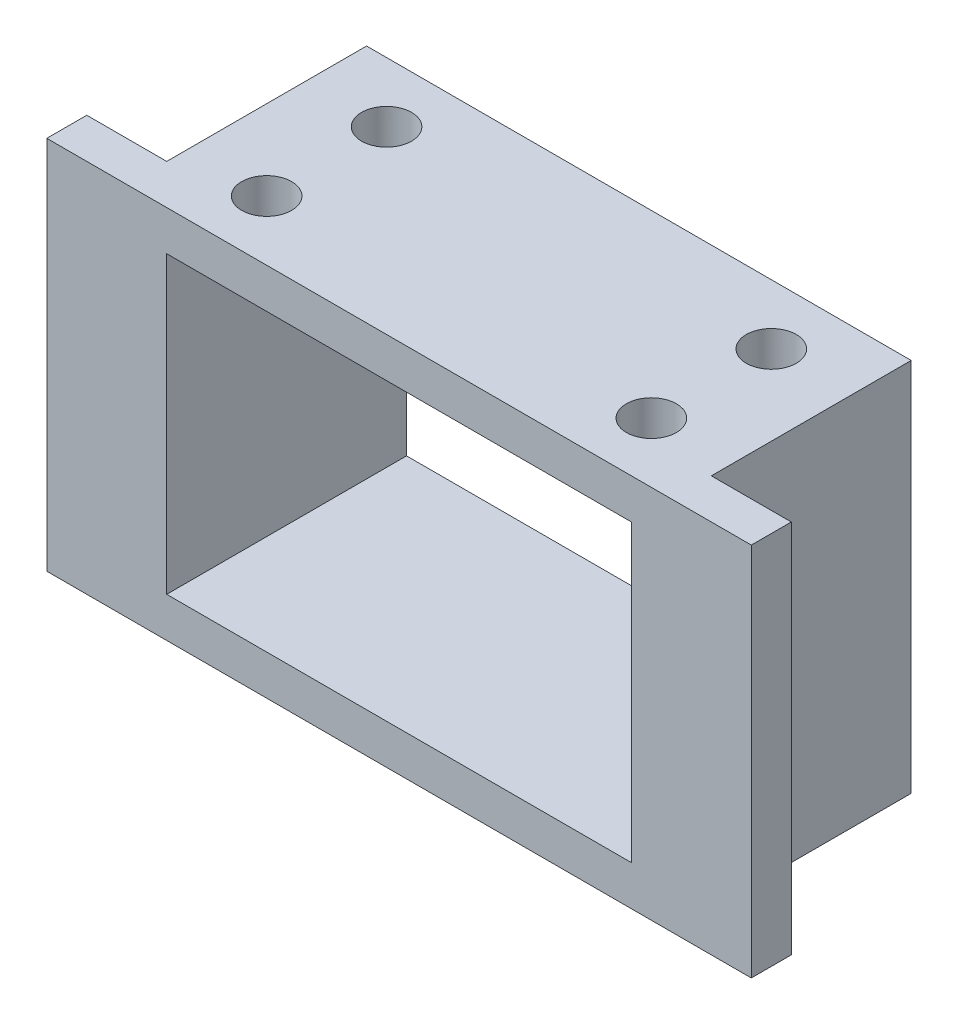
ISO-10303-21;
HEADER;
FILE_DESCRIPTION(('STEP AP214'),'2;1');
FILE_NAME('part.step','',(''),(''),'','','');
FILE_SCHEMA(('AUTOMOTIVE_DESIGN { 1 0 10303 214 1 1 1 1 }'));
ENDSEC;
DATA;
#1=APPLICATION_CONTEXT('core data for automotive mechanical design processes');
#2=APPLICATION_PROTOCOL_DEFINITION('international standard','automotive_design',2000,#1);
#3=PRODUCT_CONTEXT('',#1,'mechanical');
#4=PRODUCT('Part','Part','',(#3));
#5=PRODUCT_RELATED_PRODUCT_CATEGORY('part','',(#4));
#6=PRODUCT_DEFINITION_FORMATION('','',#4);
#7=PRODUCT_DEFINITION_CONTEXT('part definition',#1,'design');
#8=PRODUCT_DEFINITION('design','',#6,#7);
#9=PRODUCT_DEFINITION_SHAPE('','',#8);
#10=(LENGTH_UNIT() NAMED_UNIT(*) SI_UNIT(.MILLI.,.METRE.));
#11=(NAMED_UNIT(*) PLANE_ANGLE_UNIT() SI_UNIT($,.RADIAN.));
#12=(NAMED_UNIT(*) SI_UNIT($,.STERADIAN.) SOLID_ANGLE_UNIT());
#13=UNCERTAINTY_MEASURE_WITH_UNIT(LENGTH_MEASURE(1.E-05),#10,'distance_accuracy_value','');
#14=(GEOMETRIC_REPRESENTATION_CONTEXT(3) GLOBAL_UNCERTAINTY_ASSIGNED_CONTEXT((#13)) GLOBAL_UNIT_ASSIGNED_CONTEXT((#10,
#11,#12)) REPRESENTATION_CONTEXT('',''));
#15=CARTESIAN_POINT('',(0.,0.,0.));
#16=DIRECTION('',(0.,0.,1.));
#17=DIRECTION('',(1.,0.,0.));
#18=AXIS2_PLACEMENT_3D('',#15,#16,#17);
#19=CARTESIAN_POINT('',(0.,0.,18.));
#20=DIRECTION('',(0.,0.,1.));
#21=DIRECTION('',(1.,0.,0.));
#22=AXIS2_PLACEMENT_3D('',#19,#20,#21);
#23=PLANE('',#22);
#24=DIRECTION('',(0.,-1.,0.));
#25=VECTOR('',#24,1.);
#26=CARTESIAN_POINT('',(-2.,2.,18.));
#27=LINE('',#26,#25);
#28=CARTESIAN_POINT('',(-2.,2.,18.));
#29=VERTEX_POINT('',#28);
#30=CARTESIAN_POINT('',(-2.,-16.76,18.));
#31=VERTEX_POINT('',#30);
#32=EDGE_CURVE('E159',#29,#31,#27,.T.);
#33=ORIENTED_EDGE('',*,*,#32,.T.);
#34=DIRECTION('',(-1.,0.,0.));
#35=VECTOR('',#34,1.);
#36=CARTESIAN_POINT('',(0.,-16.76,18.));
#37=LINE('',#36,#35);
#38=CARTESIAN_POINT('',(-6.,-16.76,18.));
#39=VERTEX_POINT('',#38);
#40=EDGE_CURVE('E204',#31,#39,#37,.T.);
#41=ORIENTED_EDGE('',*,*,#40,.T.);
#42=DIRECTION('',(0.,-1.,0.));
#43=VECTOR('',#42,1.);
#44=CARTESIAN_POINT('',(-6.,2.,18.));
#45=LINE('',#44,#43);
#46=CARTESIAN_POINT('',(-6.,2.,18.));
#47=VERTEX_POINT('',#46);
#48=EDGE_CURVE('E198',#47,#39,#45,.T.);
#49=ORIENTED_EDGE('',*,*,#48,.F.);
#50=DIRECTION('',(-1.,0.,0.));
#51=VECTOR('',#50,1.);
#52=CARTESIAN_POINT('',(0.,2.,18.));
#53=LINE('',#52,#51);
#54=EDGE_CURVE('E197',#29,#47,#53,.T.);
#55=ORIENTED_EDGE('',*,*,#54,.F.);
#56=EDGE_LOOP('',(#33,#41,#49,#55));
#57=FACE_BOUND('',#56,.T.);
#58=ADVANCED_FACE('F41',(#57),#23,.F.);
#59=DIRECTION('',(0.,1.,0.));
#60=VECTOR('',#59,1.);
#61=CARTESIAN_POINT('',(25.25,2.,18.));
#62=LINE('',#61,#60);
#63=CARTESIAN_POINT('',(25.25,-16.76,18.));
#64=VERTEX_POINT('',#63);
#65=CARTESIAN_POINT('',(25.25,2.,18.));
#66=VERTEX_POINT('',#65);
#67=EDGE_CURVE('E166',#64,#66,#62,.T.);
#68=ORIENTED_EDGE('',*,*,#67,.T.);
#69=CARTESIAN_POINT('',(29.25,2.,18.));
#70=VERTEX_POINT('',#69);
#71=EDGE_CURVE('E211',#70,#66,#53,.T.);
#72=ORIENTED_EDGE('',*,*,#71,.F.);
#73=DIRECTION('',(0.,1.,0.));
#74=VECTOR('',#73,1.);
#75=CARTESIAN_POINT('',(29.25,2.,18.));
#76=LINE('',#75,#74);
#77=CARTESIAN_POINT('',(29.25,-16.76,18.));
#78=VERTEX_POINT('',#77);
#79=EDGE_CURVE('E227',#78,#70,#76,.T.);
#80=ORIENTED_EDGE('',*,*,#79,.F.);
#81=EDGE_CURVE('E201',#78,#64,#37,.T.);
#82=ORIENTED_EDGE('',*,*,#81,.T.);
#83=EDGE_LOOP('',(#68,#72,#80,#82));
#84=FACE_BOUND('',#83,.T.);
#85=ADVANCED_FACE('F240',(#84),#23,.F.);
#86=CARTESIAN_POINT('',(-2.,-16.76,18.));
#87=DIRECTION('',(0.,1.,0.));
#88=DIRECTION('',(-1.,0.,0.));
#89=AXIS2_PLACEMENT_3D('',#86,#87,#88);
#90=PLANE('',#89);
#91=DIRECTION('',(-1.,0.,0.));
#92=VECTOR('',#91,1.);
#93=CARTESIAN_POINT('',(0.,-16.76,20.));
#94=LINE('',#93,#92);
#95=CARTESIAN_POINT('',(29.25,-16.76,20.));
#96=VERTEX_POINT('',#95);
#97=CARTESIAN_POINT('',(-6.,-16.76,20.));
#98=VERTEX_POINT('',#97);
#99=EDGE_CURVE('E143',#96,#98,#94,.T.);
#100=ORIENTED_EDGE('',*,*,#99,.T.);
#101=DIRECTION('',(0.,0.,-1.));
#102=VECTOR('',#101,1.);
#103=CARTESIAN_POINT('',(-6.,-16.76,28.));
#104=LINE('',#103,#102);
#105=EDGE_CURVE('E187',#98,#39,#104,.T.);
#106=ORIENTED_EDGE('',*,*,#105,.T.);
#107=ORIENTED_EDGE('',*,*,#40,.F.);
#108=DIRECTION('',(0.,0.,-1.));
#109=VECTOR('',#108,1.);
#110=CARTESIAN_POINT('',(-2.,-16.76,18.));
#111=LINE('',#110,#109);
#112=CARTESIAN_POINT('',(-2.,-16.76,8.));
#113=VERTEX_POINT('',#112);
#114=EDGE_CURVE('E177',#31,#113,#111,.T.);
#115=ORIENTED_EDGE('',*,*,#114,.T.);
#116=DIRECTION('',(-1.,0.,0.));
#117=VECTOR('',#116,1.);
#118=CARTESIAN_POINT('',(-2.,-16.76,8.));
#119=LINE('',#118,#117);
#120=CARTESIAN_POINT('',(25.25,-16.76,8.));
#121=VERTEX_POINT('',#120);
#122=EDGE_CURVE('E245',#121,#113,#119,.T.);
#123=ORIENTED_EDGE('',*,*,#122,.F.);
#124=DIRECTION('',(0.,0.,-1.));
#125=VECTOR('',#124,1.);
#126=CARTESIAN_POINT('',(25.25,-16.76,18.));
#127=LINE('',#126,#125);
#128=EDGE_CURVE('E174',#64,#121,#127,.T.);
#129=ORIENTED_EDGE('',*,*,#128,.F.);
#130=ORIENTED_EDGE('',*,*,#81,.F.);
#131=DIRECTION('',(0.,0.,-1.));
#132=VECTOR('',#131,1.);
#133=CARTESIAN_POINT('',(29.25,-16.76,28.));
#134=LINE('',#133,#132);
#135=EDGE_CURVE('E229',#96,#78,#134,.T.);
#136=ORIENTED_EDGE('',*,*,#135,.F.);
#137=EDGE_LOOP('',(#100,#106,#107,#115,#123,#129,#130,#136));
#138=FACE_BOUND('',#137,.T.);
#139=ADVANCED_FACE('F242',(#138),#90,.F.);
#140=CARTESIAN_POINT('',(23.25,0.,18.));
#141=DIRECTION('',(-1.,0.,0.));
#142=DIRECTION('',(0.,-1.,0.));
#143=AXIS2_PLACEMENT_3D('',#140,#141,#142);
#144=PLANE('',#143);
#145=DIRECTION('',(0.,0.,-1.));
#146=VECTOR('',#145,1.);
#147=CARTESIAN_POINT('',(23.25,0.,18.));
#148=LINE('',#147,#146);
#149=CARTESIAN_POINT('',(23.25,0.,20.));
#150=VERTEX_POINT('',#149);
#151=CARTESIAN_POINT('',(23.25,0.,8.));
#152=VERTEX_POINT('',#151);
#153=EDGE_CURVE('E157',#150,#152,#148,.T.);
#154=ORIENTED_EDGE('',*,*,#153,.T.);
#155=DIRECTION('',(0.,1.,0.));
#156=VECTOR('',#155,1.);
#157=CARTESIAN_POINT('',(23.25,0.,8.));
#158=LINE('',#157,#156);
#159=CARTESIAN_POINT('',(23.25,-14.76,8.));
#160=VERTEX_POINT('',#159);
#161=EDGE_CURVE('E56',#160,#152,#158,.T.);
#162=ORIENTED_EDGE('',*,*,#161,.F.);
#163=DIRECTION('',(0.,0.,-1.));
#164=VECTOR('',#163,1.);
#165=CARTESIAN_POINT('',(23.25,-14.76,18.));
#166=LINE('',#165,#164);
#167=CARTESIAN_POINT('',(23.25,-14.76,20.));
#168=VERTEX_POINT('',#167);
#169=EDGE_CURVE('E149',#168,#160,#166,.T.);
#170=ORIENTED_EDGE('',*,*,#169,.F.);
#171=DIRECTION('',(0.,-1.,0.));
#172=VECTOR('',#171,1.);
#173=CARTESIAN_POINT('',(23.25,0.,20.));
#174=LINE('',#173,#172);
#175=EDGE_CURVE('E131',#150,#168,#174,.T.);
#176=ORIENTED_EDGE('',*,*,#175,.F.);
#177=EDGE_LOOP('',(#154,#162,#170,#176));
#178=FACE_BOUND('',#177,.T.);
#179=ADVANCED_FACE('F156',(#178),#144,.T.);
#180=CARTESIAN_POINT('',(25.25,2.,18.));
#181=DIRECTION('',(-1.,0.,0.));
#182=DIRECTION('',(0.,-1.,0.));
#183=AXIS2_PLACEMENT_3D('',#180,#181,#182);
#184=PLANE('',#183);
#185=DIRECTION('',(0.,1.,0.));
#186=VECTOR('',#185,1.);
#187=CARTESIAN_POINT('',(25.25,-45.1600440140504,8.));
#188=LINE('',#187,#186);
#189=CARTESIAN_POINT('',(25.25,2.,8.));
#190=VERTEX_POINT('',#189);
#191=EDGE_CURVE('E256',#121,#190,#188,.T.);
#192=ORIENTED_EDGE('',*,*,#191,.T.);
#193=DIRECTION('',(0.,0.,-1.));
#194=VECTOR('',#193,1.);
#195=CARTESIAN_POINT('',(25.25,2.,18.));
#196=LINE('',#195,#194);
#197=EDGE_CURVE('E171',#66,#190,#196,.T.);
#198=ORIENTED_EDGE('',*,*,#197,.F.);
#199=ORIENTED_EDGE('',*,*,#67,.F.);
#200=ORIENTED_EDGE('',*,*,#128,.T.);
#201=EDGE_LOOP('',(#192,#198,#199,#200));
#202=FACE_BOUND('',#201,.T.);
#203=ADVANCED_FACE('F248',(#202),#184,.F.);
#204=CARTESIAN_POINT('',(-2.,-45.1600440140504,8.));
#205=DIRECTION('',(0.,0.,1.));
#206=DIRECTION('',(1.,0.,0.));
#207=AXIS2_PLACEMENT_3D('',#204,#205,#206);
#208=PLANE('',#207);
#209=DIRECTION('',(0.,1.,0.));
#210=VECTOR('',#209,1.);
#211=CARTESIAN_POINT('',(-2.,-45.1600440140504,8.));
#212=LINE('',#211,#210);
#213=CARTESIAN_POINT('',(-2.,2.,8.));
#214=VERTEX_POINT('',#213);
#215=EDGE_CURVE('E64',#113,#214,#212,.T.);
#216=ORIENTED_EDGE('',*,*,#215,.T.);
#217=DIRECTION('',(1.,0.,0.));
#218=VECTOR('',#217,1.);
#219=CARTESIAN_POINT('',(-2.,2.,8.));
#220=LINE('',#219,#218);
#221=EDGE_CURVE('E153',#214,#190,#220,.T.);
#222=ORIENTED_EDGE('',*,*,#221,.T.);
#223=ORIENTED_EDGE('',*,*,#191,.F.);
#224=ORIENTED_EDGE('',*,*,#122,.T.);
#225=EDGE_LOOP('',(#216,#222,#223,#224));
#226=FACE_BOUND('',#225,.T.);
#227=DIRECTION('',(0.,-1.,0.));
#228=VECTOR('',#227,1.);
#229=CARTESIAN_POINT('',(0.,0.,8.));
#230=LINE('',#229,#228);
#231=CARTESIAN_POINT('',(0.,0.,8.));
#232=VERTEX_POINT('',#231);
#233=CARTESIAN_POINT('',(0.,-14.76,8.));
#234=VERTEX_POINT('',#233);
#235=EDGE_CURVE('E221',#232,#234,#230,.T.);
#236=ORIENTED_EDGE('',*,*,#235,.T.);
#237=DIRECTION('',(1.,0.,0.));
#238=VECTOR('',#237,1.);
#239=CARTESIAN_POINT('',(0.,-14.76,8.));
#240=LINE('',#239,#238);
#241=EDGE_CURVE('E222',#234,#160,#240,.T.);
#242=ORIENTED_EDGE('',*,*,#241,.T.);
#243=ORIENTED_EDGE('',*,*,#161,.T.);
#244=DIRECTION('',(-1.,0.,0.));
#245=VECTOR('',#244,1.);
#246=CARTESIAN_POINT('',(0.,0.,8.));
#247=LINE('',#246,#245);
#248=EDGE_CURVE('E217',#152,#232,#247,.T.);
#249=ORIENTED_EDGE('',*,*,#248,.T.);
#250=EDGE_LOOP('',(#236,#242,#243,#249));
#251=FACE_BOUND('',#250,.T.);
#252=ADVANCED_FACE('F255',(#226,#251),#208,.F.);
#253=CARTESIAN_POINT('',(0.,0.,18.));
#254=DIRECTION('',(1.,0.,0.));
#255=DIRECTION('',(0.,1.,0.));
#256=AXIS2_PLACEMENT_3D('',#253,#254,#255);
#257=PLANE('',#256);
#258=DIRECTION('',(0.,0.,-1.));
#259=VECTOR('',#258,1.);
#260=CARTESIAN_POINT('',(0.,-14.76,18.));
#261=LINE('',#260,#259);
#262=CARTESIAN_POINT('',(0.,-14.76,20.));
#263=VERTEX_POINT('',#262);
#264=EDGE_CURVE('E151',#263,#234,#261,.T.);
#265=ORIENTED_EDGE('',*,*,#264,.T.);
#266=ORIENTED_EDGE('',*,*,#235,.F.);
#267=DIRECTION('',(0.,0.,-1.));
#268=VECTOR('',#267,1.);
#269=CARTESIAN_POINT('',(0.,0.,18.));
#270=LINE('',#269,#268);
#271=CARTESIAN_POINT('',(0.,0.,20.));
#272=VERTEX_POINT('',#271);
#273=EDGE_CURVE('E161',#272,#232,#270,.T.);
#274=ORIENTED_EDGE('',*,*,#273,.F.);
#275=DIRECTION('',(0.,1.,0.));
#276=VECTOR('',#275,1.);
#277=CARTESIAN_POINT('',(0.,0.,20.));
#278=LINE('',#277,#276);
#279=EDGE_CURVE('E142',#263,#272,#278,.T.);
#280=ORIENTED_EDGE('',*,*,#279,.F.);
#281=EDGE_LOOP('',(#265,#266,#274,#280));
#282=FACE_BOUND('',#281,.T.);
#283=ADVANCED_FACE('F220',(#282),#257,.T.);
#284=CARTESIAN_POINT('',(0.,-14.76,18.));
#285=DIRECTION('',(0.,1.,0.));
#286=DIRECTION('',(0.,0.,1.));
#287=AXIS2_PLACEMENT_3D('',#284,#285,#286);
#288=PLANE('',#287);
#289=DIRECTION('',(-1.,0.,0.));
#290=VECTOR('',#289,1.);
#291=CARTESIAN_POINT('',(0.,-14.76,20.));
#292=LINE('',#291,#290);
#293=EDGE_CURVE('E135',#168,#263,#292,.T.);
#294=ORIENTED_EDGE('',*,*,#293,.F.);
#295=ORIENTED_EDGE('',*,*,#169,.T.);
#296=ORIENTED_EDGE('',*,*,#241,.F.);
#297=ORIENTED_EDGE('',*,*,#264,.F.);
#298=EDGE_LOOP('',(#294,#295,#296,#297));
#299=FACE_BOUND('',#298,.T.);
#300=ADVANCED_FACE('F147',(#299),#288,.T.);
#301=CARTESIAN_POINT('',(0.,0.,18.));
#302=DIRECTION('',(0.,-1.,0.));
#303=DIRECTION('',(0.,0.,-1.));
#304=AXIS2_PLACEMENT_3D('',#301,#302,#303);
#305=PLANE('',#304);
#306=CARTESIAN_POINT('',(21.25,0.,17.));
#307=DIRECTION('',(0.,-1.,0.));
#308=DIRECTION('',(0.,0.,-1.));
#309=AXIS2_PLACEMENT_3D('',#306,#307,#308);
#310=CIRCLE('',#309,1.25);
#311=CARTESIAN_POINT('',(21.25,0.,15.75));
#312=VERTEX_POINT('',#311);
#313=EDGE_CURVE('E272',#312,#312,#310,.F.);
#314=ORIENTED_EDGE('',*,*,#313,.T.);
#315=EDGE_LOOP('',(#314));
#316=FACE_BOUND('',#315,.T.);
#317=CARTESIAN_POINT('',(2.,0.,11.));
#318=DIRECTION('',(0.,-1.,0.));
#319=DIRECTION('',(0.,0.,-1.));
#320=AXIS2_PLACEMENT_3D('',#317,#318,#319);
#321=CIRCLE('',#320,1.25);
#322=CARTESIAN_POINT('',(2.,0.,9.75));
#323=VERTEX_POINT('',#322);
#324=EDGE_CURVE('E271',#323,#323,#321,.F.);
#325=ORIENTED_EDGE('',*,*,#324,.T.);
#326=EDGE_LOOP('',(#325));
#327=FACE_BOUND('',#326,.T.);
#328=CARTESIAN_POINT('',(2.,0.,17.));
#329=DIRECTION('',(0.,-1.,0.));
#330=DIRECTION('',(0.,0.,-1.));
#331=AXIS2_PLACEMENT_3D('',#328,#329,#330);
#332=CIRCLE('',#331,1.25);
#333=CARTESIAN_POINT('',(2.,0.,15.75));
#334=VERTEX_POINT('',#333);
#335=EDGE_CURVE('E278',#334,#334,#332,.F.);
#336=ORIENTED_EDGE('',*,*,#335,.T.);
#337=EDGE_LOOP('',(#336));
#338=FACE_BOUND('',#337,.T.);
#339=CARTESIAN_POINT('',(21.25,0.,11.));
#340=DIRECTION('',(0.,-1.,0.));
#341=DIRECTION('',(0.,0.,-1.));
#342=AXIS2_PLACEMENT_3D('',#339,#340,#341);
#343=CIRCLE('',#342,1.25);
#344=CARTESIAN_POINT('',(21.25,0.,9.75));
#345=VERTEX_POINT('',#344);
#346=EDGE_CURVE('E154',#345,#345,#343,.F.);
#347=ORIENTED_EDGE('',*,*,#346,.T.);
#348=EDGE_LOOP('',(#347));
#349=FACE_BOUND('',#348,.T.);
#350=ORIENTED_EDGE('',*,*,#248,.F.);
#351=ORIENTED_EDGE('',*,*,#153,.F.);
#352=DIRECTION('',(1.,0.,0.));
#353=VECTOR('',#352,1.);
#354=CARTESIAN_POINT('',(0.,0.,20.));
#355=LINE('',#354,#353);
#356=EDGE_CURVE('E138',#272,#150,#355,.T.);
#357=ORIENTED_EDGE('',*,*,#356,.F.);
#358=ORIENTED_EDGE('',*,*,#273,.T.);
#359=EDGE_LOOP('',(#350,#351,#357,#358));
#360=FACE_BOUND('',#359,.T.);
#361=ADVANCED_FACE('F216',(#316,#327,#338,#349,#360),#305,.T.);
#362=CARTESIAN_POINT('',(-2.,2.,18.));
#363=DIRECTION('',(1.,0.,0.));
#364=DIRECTION('',(0.,1.,0.));
#365=AXIS2_PLACEMENT_3D('',#362,#363,#364);
#366=PLANE('',#365);
#367=DIRECTION('',(0.,0.,-1.));
#368=VECTOR('',#367,1.);
#369=CARTESIAN_POINT('',(-2.,2.,18.));
#370=LINE('',#369,#368);
#371=EDGE_CURVE('E168',#29,#214,#370,.T.);
#372=ORIENTED_EDGE('',*,*,#371,.T.);
#373=ORIENTED_EDGE('',*,*,#215,.F.);
#374=ORIENTED_EDGE('',*,*,#114,.F.);
#375=ORIENTED_EDGE('',*,*,#32,.F.);
#376=EDGE_LOOP('',(#372,#373,#374,#375));
#377=FACE_BOUND('',#376,.T.);
#378=ADVANCED_FACE('F43',(#377),#366,.F.);
#379=CARTESIAN_POINT('',(-2.,2.,18.));
#380=DIRECTION('',(0.,-1.,0.));
#381=DIRECTION('',(0.,0.,-1.));
#382=AXIS2_PLACEMENT_3D('',#379,#380,#381);
#383=PLANE('',#382);
#384=CARTESIAN_POINT('',(21.25,2.,17.));
#385=DIRECTION('',(0.,1.,0.));
#386=DIRECTION('',(0.,0.,1.));
#387=AXIS2_PLACEMENT_3D('',#384,#385,#386);
#388=CIRCLE('',#387,1.25);
#389=CARTESIAN_POINT('',(21.25,2.,18.25));
#390=VERTEX_POINT('',#389);
#391=EDGE_CURVE('E268',#390,#390,#388,.T.);
#392=ORIENTED_EDGE('',*,*,#391,.F.);
#393=EDGE_LOOP('',(#392));
#394=FACE_BOUND('',#393,.T.);
#395=CARTESIAN_POINT('',(2.,2.,11.));
#396=DIRECTION('',(0.,1.,0.));
#397=DIRECTION('',(0.,0.,1.));
#398=AXIS2_PLACEMENT_3D('',#395,#396,#397);
#399=CIRCLE('',#398,1.25);
#400=CARTESIAN_POINT('',(2.,2.,12.25));
#401=VERTEX_POINT('',#400);
#402=EDGE_CURVE('E275',#401,#401,#399,.T.);
#403=ORIENTED_EDGE('',*,*,#402,.F.);
#404=EDGE_LOOP('',(#403));
#405=FACE_BOUND('',#404,.T.);
#406=CARTESIAN_POINT('',(2.,2.,17.));
#407=DIRECTION('',(0.,1.,0.));
#408=DIRECTION('',(0.,0.,1.));
#409=AXIS2_PLACEMENT_3D('',#406,#407,#408);
#410=CIRCLE('',#409,1.25);
#411=CARTESIAN_POINT('',(2.,2.,18.25));
#412=VERTEX_POINT('',#411);
#413=EDGE_CURVE('E267',#412,#412,#410,.T.);
#414=ORIENTED_EDGE('',*,*,#413,.F.);
#415=EDGE_LOOP('',(#414));
#416=FACE_BOUND('',#415,.T.);
#417=CARTESIAN_POINT('',(21.25,2.,11.));
#418=DIRECTION('',(0.,1.,0.));
#419=DIRECTION('',(0.,0.,1.));
#420=AXIS2_PLACEMENT_3D('',#417,#418,#419);
#421=CIRCLE('',#420,1.25);
#422=CARTESIAN_POINT('',(21.25,2.,12.25));
#423=VERTEX_POINT('',#422);
#424=EDGE_CURVE('E264',#423,#423,#421,.T.);
#425=ORIENTED_EDGE('',*,*,#424,.F.);
#426=EDGE_LOOP('',(#425));
#427=FACE_BOUND('',#426,.T.);
#428=ORIENTED_EDGE('',*,*,#197,.T.);
#429=ORIENTED_EDGE('',*,*,#221,.F.);
#430=ORIENTED_EDGE('',*,*,#371,.F.);
#431=ORIENTED_EDGE('',*,*,#54,.T.);
#432=DIRECTION('',(0.,0.,-1.));
#433=VECTOR('',#432,1.);
#434=CARTESIAN_POINT('',(-6.,2.,28.));
#435=LINE('',#434,#433);
#436=CARTESIAN_POINT('',(-6.,2.,20.));
#437=VERTEX_POINT('',#436);
#438=EDGE_CURVE('E184',#437,#47,#435,.T.);
#439=ORIENTED_EDGE('',*,*,#438,.F.);
#440=DIRECTION('',(-1.,0.,0.));
#441=VECTOR('',#440,1.);
#442=CARTESIAN_POINT('',(0.,2.,20.));
#443=LINE('',#442,#441);
#444=CARTESIAN_POINT('',(29.25,2.,20.));
#445=VERTEX_POINT('',#444);
#446=EDGE_CURVE('E195',#445,#437,#443,.T.);
#447=ORIENTED_EDGE('',*,*,#446,.F.);
#448=DIRECTION('',(0.,0.,-1.));
#449=VECTOR('',#448,1.);
#450=CARTESIAN_POINT('',(29.25,2.,28.));
#451=LINE('',#450,#449);
#452=EDGE_CURVE('E230',#445,#70,#451,.T.);
#453=ORIENTED_EDGE('',*,*,#452,.T.);
#454=ORIENTED_EDGE('',*,*,#71,.T.);
#455=EDGE_LOOP('',(#428,#429,#430,#431,#439,#447,#453,#454));
#456=FACE_BOUND('',#455,.T.);
#457=ADVANCED_FACE('F193',(#394,#405,#416,#427,#456),#383,.F.);
#458=CARTESIAN_POINT('',(0.,0.,20.));
#459=DIRECTION('',(0.,0.,1.));
#460=DIRECTION('',(1.,0.,0.));
#461=AXIS2_PLACEMENT_3D('',#458,#459,#460);
#462=PLANE('',#461);
#463=ORIENTED_EDGE('',*,*,#175,.T.);
#464=ORIENTED_EDGE('',*,*,#293,.T.);
#465=ORIENTED_EDGE('',*,*,#279,.T.);
#466=ORIENTED_EDGE('',*,*,#356,.T.);
#467=EDGE_LOOP('',(#463,#464,#465,#466));
#468=FACE_BOUND('',#467,.T.);
#469=DIRECTION('',(0.,1.,0.));
#470=VECTOR('',#469,1.);
#471=CARTESIAN_POINT('',(-6.,0.,20.));
#472=LINE('',#471,#470);
#473=EDGE_CURVE('E49',#98,#437,#472,.T.);
#474=ORIENTED_EDGE('',*,*,#473,.F.);
#475=ORIENTED_EDGE('',*,*,#99,.F.);
#476=DIRECTION('',(0.,-1.,0.));
#477=VECTOR('',#476,1.);
#478=CARTESIAN_POINT('',(29.25,0.,20.));
#479=LINE('',#478,#477);
#480=EDGE_CURVE('E11',#445,#96,#479,.T.);
#481=ORIENTED_EDGE('',*,*,#480,.F.);
#482=ORIENTED_EDGE('',*,*,#446,.T.);
#483=EDGE_LOOP('',(#474,#475,#481,#482));
#484=FACE_BOUND('',#483,.T.);
#485=ADVANCED_FACE('F133',(#468,#484),#462,.T.);
#486=CARTESIAN_POINT('',(-6.,2.,28.));
#487=DIRECTION('',(1.,0.,0.));
#488=DIRECTION('',(0.,1.,0.));
#489=AXIS2_PLACEMENT_3D('',#486,#487,#488);
#490=PLANE('',#489);
#491=ORIENTED_EDGE('',*,*,#473,.T.);
#492=ORIENTED_EDGE('',*,*,#438,.T.);
#493=ORIENTED_EDGE('',*,*,#48,.T.);
#494=ORIENTED_EDGE('',*,*,#105,.F.);
#495=EDGE_LOOP('',(#491,#492,#493,#494));
#496=FACE_BOUND('',#495,.T.);
#497=ADVANCED_FACE('F182',(#496),#490,.F.);
#498=CARTESIAN_POINT('',(29.25,2.,28.));
#499=DIRECTION('',(-1.,0.,0.));
#500=DIRECTION('',(0.,-1.,0.));
#501=AXIS2_PLACEMENT_3D('',#498,#499,#500);
#502=PLANE('',#501);
#503=ORIENTED_EDGE('',*,*,#480,.T.);
#504=ORIENTED_EDGE('',*,*,#135,.T.);
#505=ORIENTED_EDGE('',*,*,#79,.T.);
#506=ORIENTED_EDGE('',*,*,#452,.F.);
#507=EDGE_LOOP('',(#503,#504,#505,#506));
#508=FACE_BOUND('',#507,.T.);
#509=ADVANCED_FACE('F235',(#508),#502,.F.);
#510=CARTESIAN_POINT('',(21.25,-3.53553390593274,11.));
#511=DIRECTION('',(0.,1.,0.));
#512=DIRECTION('',(0.,0.,1.));
#513=AXIS2_PLACEMENT_3D('',#510,#511,#512);
#514=CYLINDRICAL_SURFACE('',#513,1.25);
#515=ORIENTED_EDGE('',*,*,#424,.T.);
#516=EDGE_LOOP('',(#515));
#517=FACE_BOUND('',#516,.T.);
#518=ORIENTED_EDGE('',*,*,#346,.F.);
#519=EDGE_LOOP('',(#518));
#520=FACE_BOUND('',#519,.T.);
#521=ADVANCED_FACE('F291',(#517,#520),#514,.F.);
#522=CARTESIAN_POINT('',(2.,-3.53553390593274,17.));
#523=DIRECTION('',(0.,1.,0.));
#524=DIRECTION('',(0.,0.,1.));
#525=AXIS2_PLACEMENT_3D('',#522,#523,#524);
#526=CYLINDRICAL_SURFACE('',#525,1.25);
#527=ORIENTED_EDGE('',*,*,#413,.T.);
#528=EDGE_LOOP('',(#527));
#529=FACE_BOUND('',#528,.T.);
#530=ORIENTED_EDGE('',*,*,#335,.F.);
#531=EDGE_LOOP('',(#530));
#532=FACE_BOUND('',#531,.T.);
#533=ADVANCED_FACE('F288',(#529,#532),#526,.F.);
#534=CARTESIAN_POINT('',(2.,-3.53553390593274,11.));
#535=DIRECTION('',(0.,1.,0.));
#536=DIRECTION('',(0.,0.,1.));
#537=AXIS2_PLACEMENT_3D('',#534,#535,#536);
#538=CYLINDRICAL_SURFACE('',#537,1.25);
#539=ORIENTED_EDGE('',*,*,#402,.T.);
#540=EDGE_LOOP('',(#539));
#541=FACE_BOUND('',#540,.T.);
#542=ORIENTED_EDGE('',*,*,#324,.F.);
#543=EDGE_LOOP('',(#542));
#544=FACE_BOUND('',#543,.T.);
#545=ADVANCED_FACE('F290',(#541,#544),#538,.F.);
#546=CARTESIAN_POINT('',(21.25,-3.53553390593274,17.));
#547=DIRECTION('',(0.,1.,0.));
#548=DIRECTION('',(0.,0.,1.));
#549=AXIS2_PLACEMENT_3D('',#546,#547,#548);
#550=CYLINDRICAL_SURFACE('',#549,1.25);
#551=ORIENTED_EDGE('',*,*,#391,.T.);
#552=EDGE_LOOP('',(#551));
#553=FACE_BOUND('',#552,.T.);
#554=ORIENTED_EDGE('',*,*,#313,.F.);
#555=EDGE_LOOP('',(#554));
#556=FACE_BOUND('',#555,.T.);
#557=ADVANCED_FACE('F298',(#553,#556),#550,.F.);
#558=CLOSED_SHELL('',(#58,#85,#139,#179,#203,#252,#283,#300,#361,#378,#457,#485,#497,#509,#521,
#533,#545,#557));
#559=MANIFOLD_SOLID_BREP('B2',#558);
#560=ADVANCED_BREP_SHAPE_REPRESENTATION('',(#18,#559),#14);
#561=SHAPE_DEFINITION_REPRESENTATION(#9,#560);
ENDSEC;
END-ISO-10303-21;
